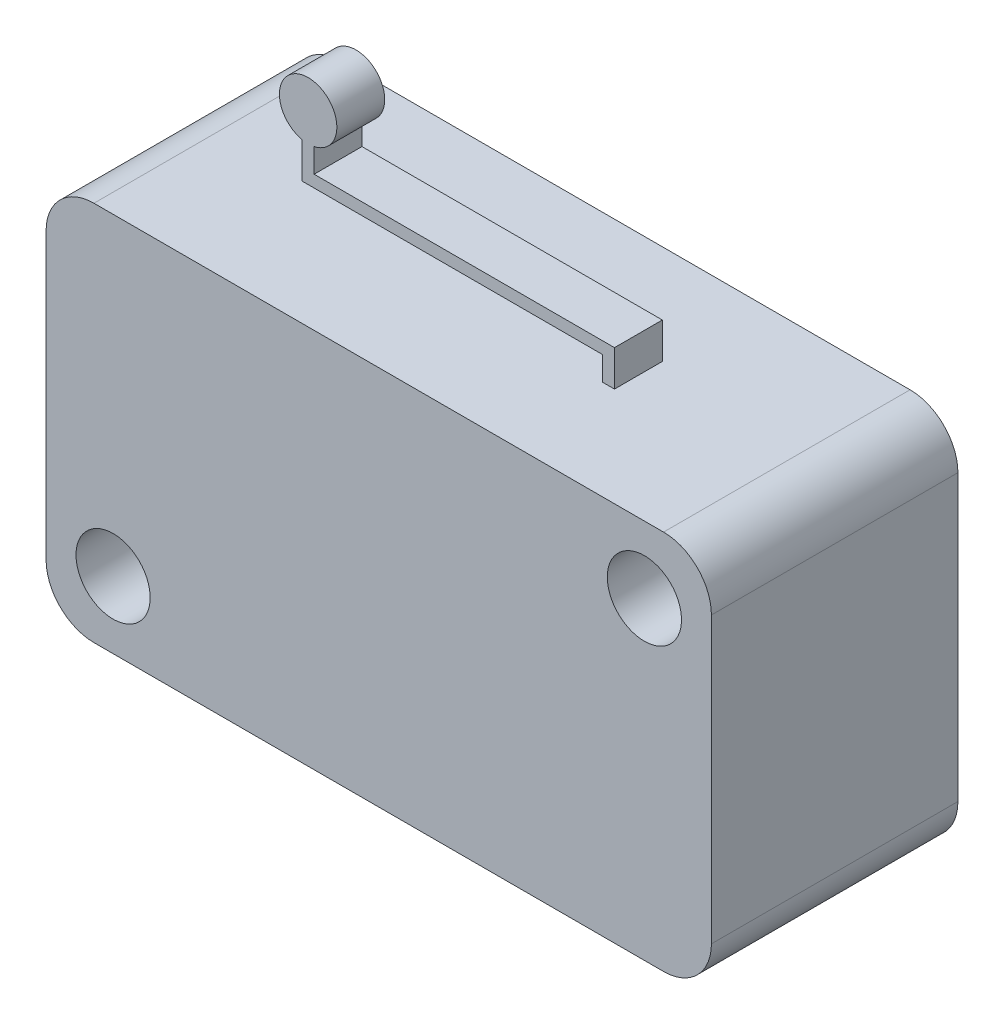
ISO-10303-21;
HEADER;
FILE_DESCRIPTION(('STEP AP214'),'2;1');
FILE_NAME('part.step','',(''),(''),'','','');
FILE_SCHEMA(('AUTOMOTIVE_DESIGN { 1 0 10303 214 1 1 1 1 }'));
ENDSEC;
DATA;
#1=APPLICATION_CONTEXT('core data for automotive mechanical design processes');
#2=APPLICATION_PROTOCOL_DEFINITION('international standard','automotive_design',2000,#1);
#3=PRODUCT_CONTEXT('',#1,'mechanical');
#4=PRODUCT('Part','Part','',(#3));
#5=PRODUCT_RELATED_PRODUCT_CATEGORY('part','',(#4));
#6=PRODUCT_DEFINITION_FORMATION('','',#4);
#7=PRODUCT_DEFINITION_CONTEXT('part definition',#1,'design');
#8=PRODUCT_DEFINITION('design','',#6,#7);
#9=PRODUCT_DEFINITION_SHAPE('','',#8);
#10=(LENGTH_UNIT() NAMED_UNIT(*) SI_UNIT(.MILLI.,.METRE.));
#11=(NAMED_UNIT(*) PLANE_ANGLE_UNIT() SI_UNIT($,.RADIAN.));
#12=(NAMED_UNIT(*) SI_UNIT($,.STERADIAN.) SOLID_ANGLE_UNIT());
#13=UNCERTAINTY_MEASURE_WITH_UNIT(LENGTH_MEASURE(1.E-05),#10,'distance_accuracy_value','');
#14=(GEOMETRIC_REPRESENTATION_CONTEXT(3) GLOBAL_UNCERTAINTY_ASSIGNED_CONTEXT((#13)) GLOBAL_UNIT_ASSIGNED_CONTEXT((#10,
#11,#12)) REPRESENTATION_CONTEXT('',''));
#15=CARTESIAN_POINT('',(0.,0.,0.));
#16=DIRECTION('',(0.,0.,1.));
#17=DIRECTION('',(1.,0.,0.));
#18=AXIS2_PLACEMENT_3D('',#15,#16,#17);
#19=CARTESIAN_POINT('',(2.00000000000001,15.9,10.3));
#20=DIRECTION('',(0.,-1.,0.));
#21=DIRECTION('',(0.,0.,-1.));
#22=AXIS2_PLACEMENT_3D('',#19,#20,#21);
#23=PLANE('',#22);
#24=DIRECTION('',(-1.,0.,0.));
#25=VECTOR('',#24,1.);
#26=CARTESIAN_POINT('',(2.00000000000001,15.9,0.));
#27=LINE('',#26,#25);
#28=CARTESIAN_POINT('',(25.8,15.9,0.));
#29=VERTEX_POINT('',#28);
#30=CARTESIAN_POINT('',(2.00000000000001,15.9,0.));
#31=VERTEX_POINT('',#30);
#32=EDGE_CURVE('E137',#29,#31,#27,.T.);
#33=ORIENTED_EDGE('',*,*,#32,.T.);
#34=DIRECTION('',(0.,0.,-1.));
#35=VECTOR('',#34,1.);
#36=CARTESIAN_POINT('',(2.00000000000001,15.9,10.3));
#37=LINE('',#36,#35);
#38=CARTESIAN_POINT('',(2.00000000000001,15.9,10.3));
#39=VERTEX_POINT('',#38);
#40=EDGE_CURVE('E134',#39,#31,#37,.T.);
#41=ORIENTED_EDGE('',*,*,#40,.F.);
#42=DIRECTION('',(-1.,0.,0.));
#43=VECTOR('',#42,1.);
#44=CARTESIAN_POINT('',(2.00000000000001,15.9,10.3));
#45=LINE('',#44,#43);
#46=CARTESIAN_POINT('',(25.8,15.9,10.3));
#47=VERTEX_POINT('',#46);
#48=EDGE_CURVE('E120',#47,#39,#45,.T.);
#49=ORIENTED_EDGE('',*,*,#48,.F.);
#50=DIRECTION('',(0.,0.,-1.));
#51=VECTOR('',#50,1.);
#52=CARTESIAN_POINT('',(25.8,15.9,10.3));
#53=LINE('',#52,#51);
#54=EDGE_CURVE('E140',#47,#29,#53,.T.);
#55=ORIENTED_EDGE('',*,*,#54,.T.);
#56=EDGE_LOOP('',(#33,#41,#49,#55));
#57=FACE_BOUND('',#56,.T.);
#58=DIRECTION('',(1.,0.,0.));
#59=VECTOR('',#58,1.);
#60=CARTESIAN_POINT('',(19.1,15.9,4.15));
#61=LINE('',#60,#59);
#62=CARTESIAN_POINT('',(19.1,15.9,4.15));
#63=VERTEX_POINT('',#62);
#64=CARTESIAN_POINT('',(19.6,15.9,4.15));
#65=VERTEX_POINT('',#64);
#66=EDGE_CURVE('E242',#63,#65,#61,.T.);
#67=ORIENTED_EDGE('',*,*,#66,.T.);
#68=DIRECTION('',(0.,0.,1.));
#69=VECTOR('',#68,1.);
#70=CARTESIAN_POINT('',(19.6,15.9,4.15));
#71=LINE('',#70,#69);
#72=CARTESIAN_POINT('',(19.6,15.9,6.15));
#73=VERTEX_POINT('',#72);
#74=EDGE_CURVE('E223',#65,#73,#71,.T.);
#75=ORIENTED_EDGE('',*,*,#74,.T.);
#76=DIRECTION('',(1.,0.,0.));
#77=VECTOR('',#76,1.);
#78=CARTESIAN_POINT('',(19.1,15.9,6.15));
#79=LINE('',#78,#77);
#80=CARTESIAN_POINT('',(19.1,15.9,6.15));
#81=VERTEX_POINT('',#80);
#82=EDGE_CURVE('E266',#81,#73,#79,.T.);
#83=ORIENTED_EDGE('',*,*,#82,.F.);
#84=DIRECTION('',(0.,0.,1.));
#85=VECTOR('',#84,1.);
#86=CARTESIAN_POINT('',(19.1,15.9,4.15));
#87=LINE('',#86,#85);
#88=EDGE_CURVE('E221',#63,#81,#87,.T.);
#89=ORIENTED_EDGE('',*,*,#88,.F.);
#90=EDGE_LOOP('',(#67,#75,#83,#89));
#91=FACE_BOUND('',#90,.T.);
#92=ADVANCED_FACE('F40',(#57,#91),#23,.F.);
#93=CARTESIAN_POINT('',(2.,2.,10.3));
#94=DIRECTION('',(0.,0.,-1.));
#95=DIRECTION('',(-1.,0.,0.));
#96=AXIS2_PLACEMENT_3D('',#93,#94,#95);
#97=PLANE('',#96);
#98=CARTESIAN_POINT('',(2.,2.,10.3));
#99=DIRECTION('',(0.,0.,1.));
#100=DIRECTION('',(-1.,0.,0.));
#101=AXIS2_PLACEMENT_3D('',#98,#99,#100);
#102=CIRCLE('',#101,2.);
#103=CARTESIAN_POINT('',(0.,2.00000000000001,10.3));
#104=VERTEX_POINT('',#103);
#105=CARTESIAN_POINT('',(2.00000000000001,0.,10.3));
#106=VERTEX_POINT('',#105);
#107=EDGE_CURVE('E165',#104,#106,#102,.T.);
#108=ORIENTED_EDGE('',*,*,#107,.T.);
#109=DIRECTION('',(1.,0.,0.));
#110=VECTOR('',#109,1.);
#111=CARTESIAN_POINT('',(2.00000000000001,0.,10.3));
#112=LINE('',#111,#110);
#113=CARTESIAN_POINT('',(25.8,0.,10.3));
#114=VERTEX_POINT('',#113);
#115=EDGE_CURVE('E105',#106,#114,#112,.T.);
#116=ORIENTED_EDGE('',*,*,#115,.T.);
#117=CARTESIAN_POINT('',(25.8,2.,10.3));
#118=DIRECTION('',(0.,0.,1.));
#119=DIRECTION('',(-1.,0.,0.));
#120=AXIS2_PLACEMENT_3D('',#117,#118,#119);
#121=CIRCLE('',#120,2.);
#122=CARTESIAN_POINT('',(27.8,2.00000000000001,10.3));
#123=VERTEX_POINT('',#122);
#124=EDGE_CURVE('E180',#114,#123,#121,.T.);
#125=ORIENTED_EDGE('',*,*,#124,.T.);
#126=DIRECTION('',(0.,1.,0.));
#127=VECTOR('',#126,1.);
#128=CARTESIAN_POINT('',(27.8,2.00000000000001,10.3));
#129=LINE('',#128,#127);
#130=CARTESIAN_POINT('',(27.8,13.9,10.3));
#131=VERTEX_POINT('',#130);
#132=EDGE_CURVE('E193',#123,#131,#129,.T.);
#133=ORIENTED_EDGE('',*,*,#132,.T.);
#134=CARTESIAN_POINT('',(25.8,13.9,10.3));
#135=DIRECTION('',(0.,0.,1.));
#136=DIRECTION('',(1.,0.,0.));
#137=AXIS2_PLACEMENT_3D('',#134,#135,#136);
#138=CIRCLE('',#137,2.);
#139=EDGE_CURVE('E128',#131,#47,#138,.T.);
#140=ORIENTED_EDGE('',*,*,#139,.T.);
#141=ORIENTED_EDGE('',*,*,#48,.T.);
#142=CARTESIAN_POINT('',(2.,13.9,10.3));
#143=DIRECTION('',(0.,0.,1.));
#144=DIRECTION('',(1.,0.,0.));
#145=AXIS2_PLACEMENT_3D('',#142,#143,#144);
#146=CIRCLE('',#145,2.);
#147=CARTESIAN_POINT('',(0.,13.9,10.3));
#148=VERTEX_POINT('',#147);
#149=EDGE_CURVE('E125',#39,#148,#146,.T.);
#150=ORIENTED_EDGE('',*,*,#149,.T.);
#151=DIRECTION('',(0.,-1.,0.));
#152=VECTOR('',#151,1.);
#153=CARTESIAN_POINT('',(0.,2.00000000000001,10.3));
#154=LINE('',#153,#152);
#155=EDGE_CURVE('E64',#148,#104,#154,.T.);
#156=ORIENTED_EDGE('',*,*,#155,.T.);
#157=EDGE_LOOP('',(#108,#116,#125,#133,#140,#141,#150,#156));
#158=FACE_BOUND('',#157,.T.);
#159=CARTESIAN_POINT('',(2.8,2.8,10.3));
#160=DIRECTION('',(0.,0.,1.));
#161=DIRECTION('',(1.,0.,0.));
#162=AXIS2_PLACEMENT_3D('',#159,#160,#161);
#163=CIRCLE('',#162,1.55);
#164=CARTESIAN_POINT('',(1.25,2.8,10.3));
#165=VERTEX_POINT('',#164);
#166=EDGE_CURVE('E153',#165,#165,#163,.T.);
#167=ORIENTED_EDGE('',*,*,#166,.F.);
#168=EDGE_LOOP('',(#167));
#169=FACE_BOUND('',#168,.T.);
#170=CARTESIAN_POINT('',(25.,13.1,10.3));
#171=DIRECTION('',(0.,0.,1.));
#172=DIRECTION('',(1.,0.,0.));
#173=AXIS2_PLACEMENT_3D('',#170,#171,#172);
#174=CIRCLE('',#173,1.55);
#175=CARTESIAN_POINT('',(23.45,13.1,10.3));
#176=VERTEX_POINT('',#175);
#177=EDGE_CURVE('E202',#176,#176,#174,.T.);
#178=ORIENTED_EDGE('',*,*,#177,.F.);
#179=EDGE_LOOP('',(#178));
#180=FACE_BOUND('',#179,.T.);
#181=ADVANCED_FACE('F122',(#158,#169,#180),#97,.F.);
#182=CARTESIAN_POINT('',(2.,2.,0.));
#183=DIRECTION('',(0.,0.,-1.));
#184=DIRECTION('',(-1.,0.,0.));
#185=AXIS2_PLACEMENT_3D('',#182,#183,#184);
#186=PLANE('',#185);
#187=CARTESIAN_POINT('',(2.8,2.8,0.));
#188=DIRECTION('',(0.,0.,1.));
#189=DIRECTION('',(1.,0.,0.));
#190=AXIS2_PLACEMENT_3D('',#187,#188,#189);
#191=CIRCLE('',#190,1.55);
#192=CARTESIAN_POINT('',(1.25,2.8,0.));
#193=VERTEX_POINT('',#192);
#194=EDGE_CURVE('E199',#193,#193,#191,.T.);
#195=ORIENTED_EDGE('',*,*,#194,.T.);
#196=EDGE_LOOP('',(#195));
#197=FACE_BOUND('',#196,.T.);
#198=CARTESIAN_POINT('',(2.,2.,0.));
#199=DIRECTION('',(0.,0.,1.));
#200=DIRECTION('',(-1.,0.,0.));
#201=AXIS2_PLACEMENT_3D('',#198,#199,#200);
#202=CIRCLE('',#201,2.);
#203=CARTESIAN_POINT('',(0.,2.00000000000001,0.));
#204=VERTEX_POINT('',#203);
#205=CARTESIAN_POINT('',(2.00000000000001,0.,0.));
#206=VERTEX_POINT('',#205);
#207=EDGE_CURVE('E149',#204,#206,#202,.T.);
#208=ORIENTED_EDGE('',*,*,#207,.F.);
#209=DIRECTION('',(0.,-1.,0.));
#210=VECTOR('',#209,1.);
#211=CARTESIAN_POINT('',(0.,2.00000000000001,0.));
#212=LINE('',#211,#210);
#213=CARTESIAN_POINT('',(0.,13.9,0.));
#214=VERTEX_POINT('',#213);
#215=EDGE_CURVE('E97',#214,#204,#212,.T.);
#216=ORIENTED_EDGE('',*,*,#215,.F.);
#217=CARTESIAN_POINT('',(2.,13.9,0.));
#218=DIRECTION('',(0.,0.,1.));
#219=DIRECTION('',(1.,0.,0.));
#220=AXIS2_PLACEMENT_3D('',#217,#218,#219);
#221=CIRCLE('',#220,2.);
#222=EDGE_CURVE('E162',#31,#214,#221,.T.);
#223=ORIENTED_EDGE('',*,*,#222,.F.);
#224=ORIENTED_EDGE('',*,*,#32,.F.);
#225=CARTESIAN_POINT('',(25.8,13.9,0.));
#226=DIRECTION('',(0.,0.,1.));
#227=DIRECTION('',(1.,0.,0.));
#228=AXIS2_PLACEMENT_3D('',#225,#226,#227);
#229=CIRCLE('',#228,2.);
#230=CARTESIAN_POINT('',(27.8,13.9,0.));
#231=VERTEX_POINT('',#230);
#232=EDGE_CURVE('E159',#231,#29,#229,.T.);
#233=ORIENTED_EDGE('',*,*,#232,.F.);
#234=DIRECTION('',(0.,1.,0.));
#235=VECTOR('',#234,1.);
#236=CARTESIAN_POINT('',(27.8,2.00000000000001,0.));
#237=LINE('',#236,#235);
#238=CARTESIAN_POINT('',(27.8,2.00000000000001,0.));
#239=VERTEX_POINT('',#238);
#240=EDGE_CURVE('E157',#239,#231,#237,.T.);
#241=ORIENTED_EDGE('',*,*,#240,.F.);
#242=CARTESIAN_POINT('',(25.8,2.,0.));
#243=DIRECTION('',(0.,0.,1.));
#244=DIRECTION('',(-1.,0.,0.));
#245=AXIS2_PLACEMENT_3D('',#242,#243,#244);
#246=CIRCLE('',#245,2.);
#247=CARTESIAN_POINT('',(25.8,0.,0.));
#248=VERTEX_POINT('',#247);
#249=EDGE_CURVE('E155',#248,#239,#246,.T.);
#250=ORIENTED_EDGE('',*,*,#249,.F.);
#251=DIRECTION('',(1.,0.,0.));
#252=VECTOR('',#251,1.);
#253=CARTESIAN_POINT('',(2.00000000000001,0.,0.));
#254=LINE('',#253,#252);
#255=EDGE_CURVE('E152',#206,#248,#254,.T.);
#256=ORIENTED_EDGE('',*,*,#255,.F.);
#257=EDGE_LOOP('',(#208,#216,#223,#224,#233,#241,#250,#256));
#258=FACE_BOUND('',#257,.T.);
#259=CARTESIAN_POINT('',(25.,13.1,0.));
#260=DIRECTION('',(0.,0.,1.));
#261=DIRECTION('',(1.,0.,0.));
#262=AXIS2_PLACEMENT_3D('',#259,#260,#261);
#263=CIRCLE('',#262,1.55);
#264=CARTESIAN_POINT('',(23.45,13.1,0.));
#265=VERTEX_POINT('',#264);
#266=EDGE_CURVE('E205',#265,#265,#263,.T.);
#267=ORIENTED_EDGE('',*,*,#266,.T.);
#268=EDGE_LOOP('',(#267));
#269=FACE_BOUND('',#268,.T.);
#270=ADVANCED_FACE('F184',(#197,#258,#269),#186,.T.);
#271=CARTESIAN_POINT('',(2.,2.,10.3));
#272=DIRECTION('',(0.,0.,-1.));
#273=DIRECTION('',(-1.,0.,0.));
#274=AXIS2_PLACEMENT_3D('',#271,#272,#273);
#275=CYLINDRICAL_SURFACE('',#274,2.);
#276=ORIENTED_EDGE('',*,*,#207,.T.);
#277=DIRECTION('',(0.,0.,-1.));
#278=VECTOR('',#277,1.);
#279=CARTESIAN_POINT('',(2.00000000000001,0.,10.3));
#280=LINE('',#279,#278);
#281=EDGE_CURVE('E11',#106,#206,#280,.T.);
#282=ORIENTED_EDGE('',*,*,#281,.F.);
#283=ORIENTED_EDGE('',*,*,#107,.F.);
#284=DIRECTION('',(0.,0.,-1.));
#285=VECTOR('',#284,1.);
#286=CARTESIAN_POINT('',(0.,2.00000000000001,10.3));
#287=LINE('',#286,#285);
#288=EDGE_CURVE('E145',#104,#204,#287,.T.);
#289=ORIENTED_EDGE('',*,*,#288,.T.);
#290=EDGE_LOOP('',(#276,#282,#283,#289));
#291=FACE_BOUND('',#290,.T.);
#292=ADVANCED_FACE('F42',(#291),#275,.T.);
#293=CARTESIAN_POINT('',(2.00000000000001,0.,10.3));
#294=DIRECTION('',(0.,1.,0.));
#295=DIRECTION('',(0.,0.,1.));
#296=AXIS2_PLACEMENT_3D('',#293,#294,#295);
#297=PLANE('',#296);
#298=ORIENTED_EDGE('',*,*,#255,.T.);
#299=DIRECTION('',(0.,0.,-1.));
#300=VECTOR('',#299,1.);
#301=CARTESIAN_POINT('',(25.8,0.,10.3));
#302=LINE('',#301,#300);
#303=EDGE_CURVE('E48',#114,#248,#302,.T.);
#304=ORIENTED_EDGE('',*,*,#303,.F.);
#305=ORIENTED_EDGE('',*,*,#115,.F.);
#306=ORIENTED_EDGE('',*,*,#281,.T.);
#307=EDGE_LOOP('',(#298,#304,#305,#306));
#308=FACE_BOUND('',#307,.T.);
#309=ADVANCED_FACE('F367',(#308),#297,.F.);
#310=CARTESIAN_POINT('',(25.8,2.,10.3));
#311=DIRECTION('',(0.,0.,-1.));
#312=DIRECTION('',(-1.,0.,0.));
#313=AXIS2_PLACEMENT_3D('',#310,#311,#312);
#314=CYLINDRICAL_SURFACE('',#313,2.);
#315=ORIENTED_EDGE('',*,*,#249,.T.);
#316=DIRECTION('',(0.,0.,-1.));
#317=VECTOR('',#316,1.);
#318=CARTESIAN_POINT('',(27.8,2.00000000000001,10.3));
#319=LINE('',#318,#317);
#320=EDGE_CURVE('E172',#123,#239,#319,.T.);
#321=ORIENTED_EDGE('',*,*,#320,.F.);
#322=ORIENTED_EDGE('',*,*,#124,.F.);
#323=ORIENTED_EDGE('',*,*,#303,.T.);
#324=EDGE_LOOP('',(#315,#321,#322,#323));
#325=FACE_BOUND('',#324,.T.);
#326=ADVANCED_FACE('F178',(#325),#314,.T.);
#327=CARTESIAN_POINT('',(27.8,2.00000000000001,10.3));
#328=DIRECTION('',(-1.,0.,0.));
#329=DIRECTION('',(0.,0.,1.));
#330=AXIS2_PLACEMENT_3D('',#327,#328,#329);
#331=PLANE('',#330);
#332=ORIENTED_EDGE('',*,*,#240,.T.);
#333=DIRECTION('',(0.,0.,-1.));
#334=VECTOR('',#333,1.);
#335=CARTESIAN_POINT('',(27.8,13.9,10.3));
#336=LINE('',#335,#334);
#337=EDGE_CURVE('E169',#131,#231,#336,.T.);
#338=ORIENTED_EDGE('',*,*,#337,.F.);
#339=ORIENTED_EDGE('',*,*,#132,.F.);
#340=ORIENTED_EDGE('',*,*,#320,.T.);
#341=EDGE_LOOP('',(#332,#338,#339,#340));
#342=FACE_BOUND('',#341,.T.);
#343=ADVANCED_FACE('F189',(#342),#331,.F.);
#344=CARTESIAN_POINT('',(25.8,13.9,10.3));
#345=DIRECTION('',(0.,0.,-1.));
#346=DIRECTION('',(-1.,0.,0.));
#347=AXIS2_PLACEMENT_3D('',#344,#345,#346);
#348=CYLINDRICAL_SURFACE('',#347,2.);
#349=ORIENTED_EDGE('',*,*,#232,.T.);
#350=ORIENTED_EDGE('',*,*,#54,.F.);
#351=ORIENTED_EDGE('',*,*,#139,.F.);
#352=ORIENTED_EDGE('',*,*,#337,.T.);
#353=EDGE_LOOP('',(#349,#350,#351,#352));
#354=FACE_BOUND('',#353,.T.);
#355=ADVANCED_FACE('F192',(#354),#348,.T.);
#356=CARTESIAN_POINT('',(2.,13.9,10.3));
#357=DIRECTION('',(0.,0.,-1.));
#358=DIRECTION('',(-1.,0.,0.));
#359=AXIS2_PLACEMENT_3D('',#356,#357,#358);
#360=CYLINDRICAL_SURFACE('',#359,2.);
#361=ORIENTED_EDGE('',*,*,#222,.T.);
#362=DIRECTION('',(0.,0.,-1.));
#363=VECTOR('',#362,1.);
#364=CARTESIAN_POINT('',(0.,13.9,10.3));
#365=LINE('',#364,#363);
#366=EDGE_CURVE('E141',#148,#214,#365,.T.);
#367=ORIENTED_EDGE('',*,*,#366,.F.);
#368=ORIENTED_EDGE('',*,*,#149,.F.);
#369=ORIENTED_EDGE('',*,*,#40,.T.);
#370=EDGE_LOOP('',(#361,#367,#368,#369));
#371=FACE_BOUND('',#370,.T.);
#372=ADVANCED_FACE('F143',(#371),#360,.T.);
#373=CARTESIAN_POINT('',(0.,2.00000000000001,10.3));
#374=DIRECTION('',(1.,0.,0.));
#375=DIRECTION('',(0.,0.,-1.));
#376=AXIS2_PLACEMENT_3D('',#373,#374,#375);
#377=PLANE('',#376);
#378=ORIENTED_EDGE('',*,*,#215,.T.);
#379=ORIENTED_EDGE('',*,*,#288,.F.);
#380=ORIENTED_EDGE('',*,*,#155,.F.);
#381=ORIENTED_EDGE('',*,*,#366,.T.);
#382=EDGE_LOOP('',(#378,#379,#380,#381));
#383=FACE_BOUND('',#382,.T.);
#384=ADVANCED_FACE('F375',(#383),#377,.F.);
#385=CARTESIAN_POINT('',(2.8,2.8,10.3));
#386=DIRECTION('',(0.,0.,-1.));
#387=DIRECTION('',(-1.,0.,0.));
#388=AXIS2_PLACEMENT_3D('',#385,#386,#387);
#389=CYLINDRICAL_SURFACE('',#388,1.55);
#390=CARTESIAN_POINT('',(1.25,2.8,10.3));
#391=CARTESIAN_POINT('',(1.25,2.8,10.1927083333333));
#392=CARTESIAN_POINT('',(1.25,2.8,10.0854166666667));
#393=CARTESIAN_POINT('',(1.25,2.8,9.87083333333333));
#394=CARTESIAN_POINT('',(1.25,2.8,9.76354166666667));
#395=CARTESIAN_POINT('',(1.25,2.8,9.54895833333333));
#396=CARTESIAN_POINT('',(1.25,2.8,9.44166666666667));
#397=CARTESIAN_POINT('',(1.25,2.8,9.22708333333333));
#398=CARTESIAN_POINT('',(1.25,2.8,9.11979166666667));
#399=CARTESIAN_POINT('',(1.25,2.8,8.90520833333333));
#400=CARTESIAN_POINT('',(1.25,2.8,8.79791666666667));
#401=CARTESIAN_POINT('',(1.25,2.8,8.58333333333333));
#402=CARTESIAN_POINT('',(1.25,2.8,8.47604166666667));
#403=CARTESIAN_POINT('',(1.25,2.8,8.26145833333333));
#404=CARTESIAN_POINT('',(1.25,2.8,8.15416666666667));
#405=CARTESIAN_POINT('',(1.25,2.8,7.93958333333333));
#406=CARTESIAN_POINT('',(1.25,2.8,7.83229166666667));
#407=CARTESIAN_POINT('',(1.25,2.8,7.61770833333333));
#408=CARTESIAN_POINT('',(1.25,2.8,7.51041666666667));
#409=CARTESIAN_POINT('',(1.25,2.8,7.29583333333333));
#410=CARTESIAN_POINT('',(1.25,2.8,7.18854166666666));
#411=CARTESIAN_POINT('',(1.25,2.8,6.97395833333333));
#412=CARTESIAN_POINT('',(1.25,2.8,6.86666666666667));
#413=CARTESIAN_POINT('',(1.25,2.8,6.65208333333333));
#414=CARTESIAN_POINT('',(1.25,2.8,6.54479166666667));
#415=CARTESIAN_POINT('',(1.25,2.8,6.33020833333333));
#416=CARTESIAN_POINT('',(1.25,2.8,6.22291666666667));
#417=CARTESIAN_POINT('',(1.25,2.8,6.00833333333333));
#418=CARTESIAN_POINT('',(1.25,2.8,5.90104166666667));
#419=CARTESIAN_POINT('',(1.25,2.8,5.68645833333333));
#420=CARTESIAN_POINT('',(1.25,2.8,5.57916666666667));
#421=CARTESIAN_POINT('',(1.25,2.8,5.36458333333333));
#422=CARTESIAN_POINT('',(1.25,2.8,5.25729166666667));
#423=CARTESIAN_POINT('',(1.25,2.8,5.04270833333333));
#424=CARTESIAN_POINT('',(1.25,2.8,4.93541666666667));
#425=CARTESIAN_POINT('',(1.25,2.8,4.72083333333333));
#426=CARTESIAN_POINT('',(1.25,2.8,4.61354166666666));
#427=CARTESIAN_POINT('',(1.25,2.8,4.39895833333333));
#428=CARTESIAN_POINT('',(1.25,2.8,4.29166666666667));
#429=CARTESIAN_POINT('',(1.25,2.8,4.07708333333333));
#430=CARTESIAN_POINT('',(1.25,2.8,3.96979166666666));
#431=CARTESIAN_POINT('',(1.25,2.8,3.75520833333333));
#432=CARTESIAN_POINT('',(1.25,2.8,3.64791666666666));
#433=CARTESIAN_POINT('',(1.25,2.8,3.43333333333333));
#434=CARTESIAN_POINT('',(1.25,2.8,3.32604166666666));
#435=CARTESIAN_POINT('',(1.25,2.8,3.11145833333333));
#436=CARTESIAN_POINT('',(1.25,2.8,3.00416666666666));
#437=CARTESIAN_POINT('',(1.25,2.8,2.78958333333333));
#438=CARTESIAN_POINT('',(1.25,2.8,2.68229166666666));
#439=CARTESIAN_POINT('',(1.25,2.8,2.46770833333333));
#440=CARTESIAN_POINT('',(1.25,2.8,2.36041666666667));
#441=CARTESIAN_POINT('',(1.25,2.8,2.14583333333333));
#442=CARTESIAN_POINT('',(1.25,2.8,2.03854166666667));
#443=CARTESIAN_POINT('',(1.25,2.8,1.82395833333333));
#444=CARTESIAN_POINT('',(1.25,2.8,1.71666666666667));
#445=CARTESIAN_POINT('',(1.25,2.8,1.50208333333333));
#446=CARTESIAN_POINT('',(1.25,2.8,1.39479166666667));
#447=CARTESIAN_POINT('',(1.25,2.8,1.18020833333333));
#448=CARTESIAN_POINT('',(1.25,2.8,1.07291666666667));
#449=CARTESIAN_POINT('',(1.25,2.8,0.858333333333333));
#450=CARTESIAN_POINT('',(1.25,2.8,0.751041666666665));
#451=CARTESIAN_POINT('',(1.25,2.8,0.536458333333331));
#452=CARTESIAN_POINT('',(1.25,2.8,0.429166666666664));
#453=CARTESIAN_POINT('',(1.25,2.8,0.214583333333331));
#454=CARTESIAN_POINT('',(1.25,2.8,0.107291666666665));
#455=CARTESIAN_POINT('',(1.25,2.8,0.));
#456=B_SPLINE_CURVE_WITH_KNOTS('',3,(#390,#391,#392,#393,#394,#395,#396,#397,#398,#399,#400,
#401,#402,#403,#404,#405,#406,#407,#408,#409,#410,#411,#412,#413,#414,#415,#416,#417,#418,#419,
#420,#421,#422,#423,#424,#425,#426,#427,#428,#429,#430,#431,#432,#433,#434,#435,#436,#437,#438,
#439,#440,#441,#442,#443,#444,#445,#446,#447,#448,#449,#450,#451,#452,#453,#454,#455),
.UNSPECIFIED.,.F.,.F.,(4,2,2,2,2,2,2,2,2,2,2,2,2,2,2,2,2,2,2,2,2,2,2,2,2,2,2,2,2,2,2,2,4),(0.,
0.321875000000001,0.64375,0.965625000000001,1.2875,1.609375,1.93125,2.253125,2.575,2.896875,
3.21875,3.540625,3.8625,4.184375,4.50625,4.828125,5.15,5.471875,5.79375,6.115625,6.4375,
6.759375,7.08125,7.403125,7.725,8.046875,8.36875,8.690625,9.0125,9.334375,9.65625,9.978125,
10.3),.UNSPECIFIED.);
#457=EDGE_CURVE('BSEAM377',#165,#193,#456,.T.);
#458=ORIENTED_EDGE('',*,*,#166,.T.);
#459=ORIENTED_EDGE('',*,*,#194,.F.);
#460=ORIENTED_EDGE('',*,*,#457,.T.);
#461=ORIENTED_EDGE('',*,*,#457,.F.);
#462=EDGE_LOOP('',(#458,#460,#459,#461));
#463=FACE_BOUND('',#462,.T.);
#464=ADVANCED_FACE('F377',(#463),#389,.F.);
#465=CARTESIAN_POINT('',(25.,13.1,10.3));
#466=DIRECTION('',(0.,0.,-1.));
#467=DIRECTION('',(-1.,0.,0.));
#468=AXIS2_PLACEMENT_3D('',#465,#466,#467);
#469=CYLINDRICAL_SURFACE('',#468,1.55);
#470=CARTESIAN_POINT('',(23.45,13.1,10.3));
#471=CARTESIAN_POINT('',(23.45,13.1,10.1927083333333));
#472=CARTESIAN_POINT('',(23.45,13.1,10.0854166666667));
#473=CARTESIAN_POINT('',(23.45,13.1,9.87083333333333));
#474=CARTESIAN_POINT('',(23.45,13.1,9.76354166666667));
#475=CARTESIAN_POINT('',(23.45,13.1,9.54895833333333));
#476=CARTESIAN_POINT('',(23.45,13.1,9.44166666666667));
#477=CARTESIAN_POINT('',(23.45,13.1,9.22708333333333));
#478=CARTESIAN_POINT('',(23.45,13.1,9.11979166666667));
#479=CARTESIAN_POINT('',(23.45,13.1,8.90520833333333));
#480=CARTESIAN_POINT('',(23.45,13.1,8.79791666666667));
#481=CARTESIAN_POINT('',(23.45,13.1,8.58333333333333));
#482=CARTESIAN_POINT('',(23.45,13.1,8.47604166666667));
#483=CARTESIAN_POINT('',(23.45,13.1,8.26145833333333));
#484=CARTESIAN_POINT('',(23.45,13.1,8.15416666666667));
#485=CARTESIAN_POINT('',(23.45,13.1,7.93958333333333));
#486=CARTESIAN_POINT('',(23.45,13.1,7.83229166666667));
#487=CARTESIAN_POINT('',(23.45,13.1,7.61770833333333));
#488=CARTESIAN_POINT('',(23.45,13.1,7.51041666666667));
#489=CARTESIAN_POINT('',(23.45,13.1,7.29583333333333));
#490=CARTESIAN_POINT('',(23.45,13.1,7.18854166666666));
#491=CARTESIAN_POINT('',(23.45,13.1,6.97395833333333));
#492=CARTESIAN_POINT('',(23.45,13.1,6.86666666666667));
#493=CARTESIAN_POINT('',(23.45,13.1,6.65208333333333));
#494=CARTESIAN_POINT('',(23.45,13.1,6.54479166666667));
#495=CARTESIAN_POINT('',(23.45,13.1,6.33020833333333));
#496=CARTESIAN_POINT('',(23.45,13.1,6.22291666666667));
#497=CARTESIAN_POINT('',(23.45,13.1,6.00833333333333));
#498=CARTESIAN_POINT('',(23.45,13.1,5.90104166666667));
#499=CARTESIAN_POINT('',(23.45,13.1,5.68645833333333));
#500=CARTESIAN_POINT('',(23.45,13.1,5.57916666666667));
#501=CARTESIAN_POINT('',(23.45,13.1,5.36458333333333));
#502=CARTESIAN_POINT('',(23.45,13.1,5.25729166666667));
#503=CARTESIAN_POINT('',(23.45,13.1,5.04270833333333));
#504=CARTESIAN_POINT('',(23.45,13.1,4.93541666666667));
#505=CARTESIAN_POINT('',(23.45,13.1,4.72083333333333));
#506=CARTESIAN_POINT('',(23.45,13.1,4.61354166666666));
#507=CARTESIAN_POINT('',(23.45,13.1,4.39895833333333));
#508=CARTESIAN_POINT('',(23.45,13.1,4.29166666666667));
#509=CARTESIAN_POINT('',(23.45,13.1,4.07708333333333));
#510=CARTESIAN_POINT('',(23.45,13.1,3.96979166666666));
#511=CARTESIAN_POINT('',(23.45,13.1,3.75520833333333));
#512=CARTESIAN_POINT('',(23.45,13.1,3.64791666666666));
#513=CARTESIAN_POINT('',(23.45,13.1,3.43333333333333));
#514=CARTESIAN_POINT('',(23.45,13.1,3.32604166666666));
#515=CARTESIAN_POINT('',(23.45,13.1,3.11145833333333));
#516=CARTESIAN_POINT('',(23.45,13.1,3.00416666666666));
#517=CARTESIAN_POINT('',(23.45,13.1,2.78958333333333));
#518=CARTESIAN_POINT('',(23.45,13.1,2.68229166666666));
#519=CARTESIAN_POINT('',(23.45,13.1,2.46770833333333));
#520=CARTESIAN_POINT('',(23.45,13.1,2.36041666666667));
#521=CARTESIAN_POINT('',(23.45,13.1,2.14583333333333));
#522=CARTESIAN_POINT('',(23.45,13.1,2.03854166666667));
#523=CARTESIAN_POINT('',(23.45,13.1,1.82395833333333));
#524=CARTESIAN_POINT('',(23.45,13.1,1.71666666666667));
#525=CARTESIAN_POINT('',(23.45,13.1,1.50208333333333));
#526=CARTESIAN_POINT('',(23.45,13.1,1.39479166666667));
#527=CARTESIAN_POINT('',(23.45,13.1,1.18020833333333));
#528=CARTESIAN_POINT('',(23.45,13.1,1.07291666666667));
#529=CARTESIAN_POINT('',(23.45,13.1,0.858333333333333));
#530=CARTESIAN_POINT('',(23.45,13.1,0.751041666666665));
#531=CARTESIAN_POINT('',(23.45,13.1,0.536458333333331));
#532=CARTESIAN_POINT('',(23.45,13.1,0.429166666666664));
#533=CARTESIAN_POINT('',(23.45,13.1,0.214583333333331));
#534=CARTESIAN_POINT('',(23.45,13.1,0.107291666666665));
#535=CARTESIAN_POINT('',(23.45,13.1,0.));
#536=B_SPLINE_CURVE_WITH_KNOTS('',3,(#470,#471,#472,#473,#474,#475,#476,#477,#478,#479,#480,
#481,#482,#483,#484,#485,#486,#487,#488,#489,#490,#491,#492,#493,#494,#495,#496,#497,#498,#499,
#500,#501,#502,#503,#504,#505,#506,#507,#508,#509,#510,#511,#512,#513,#514,#515,#516,#517,#518,
#519,#520,#521,#522,#523,#524,#525,#526,#527,#528,#529,#530,#531,#532,#533,#534,#535),
.UNSPECIFIED.,.F.,.F.,(4,2,2,2,2,2,2,2,2,2,2,2,2,2,2,2,2,2,2,2,2,2,2,2,2,2,2,2,2,2,2,2,4),(0.,
0.321875000000001,0.64375,0.965625000000001,1.2875,1.609375,1.93125,2.253125,2.575,2.896875,
3.21875,3.540625,3.8625,4.184375,4.50625,4.828125,5.15,5.471875,5.79375,6.115625,6.4375,
6.759375,7.08125,7.403125,7.725,8.046875,8.36875,8.690625,9.0125,9.334375,9.65625,9.978125,
10.3),.UNSPECIFIED.);
#537=EDGE_CURVE('BSEAM382',#176,#265,#536,.T.);
#538=ORIENTED_EDGE('',*,*,#177,.T.);
#539=ORIENTED_EDGE('',*,*,#266,.F.);
#540=ORIENTED_EDGE('',*,*,#537,.T.);
#541=ORIENTED_EDGE('',*,*,#537,.F.);
#542=EDGE_LOOP('',(#538,#540,#539,#541));
#543=FACE_BOUND('',#542,.T.);
#544=ADVANCED_FACE('F382',(#543),#469,.F.);
#545=CARTESIAN_POINT('',(6.8,19.5736694594306,4.15));
#546=DIRECTION('',(0.,0.,1.));
#547=DIRECTION('',(1.,0.,0.));
#548=AXIS2_PLACEMENT_3D('',#545,#546,#547);
#549=CYLINDRICAL_SURFACE('',#548,1.2);
#550=DIRECTION('',(0.,0.,1.));
#551=VECTOR('',#550,1.);
#552=CARTESIAN_POINT('',(6.55,18.4,4.15));
#553=LINE('',#552,#551);
#554=CARTESIAN_POINT('',(6.55,18.4,4.15));
#555=VERTEX_POINT('',#554);
#556=CARTESIAN_POINT('',(6.55,18.4,6.15));
#557=VERTEX_POINT('',#556);
#558=EDGE_CURVE('E211',#555,#557,#553,.T.);
#559=ORIENTED_EDGE('',*,*,#558,.T.);
#560=CARTESIAN_POINT('',(6.8,19.5736694594306,6.15));
#561=DIRECTION('',(0.,0.,1.));
#562=DIRECTION('',(1.,0.,0.));
#563=AXIS2_PLACEMENT_3D('',#560,#561,#562);
#564=CIRCLE('',#563,1.2);
#565=CARTESIAN_POINT('',(7.05,18.4,6.15));
#566=VERTEX_POINT('',#565);
#567=EDGE_CURVE('E274',#566,#557,#564,.T.);
#568=ORIENTED_EDGE('',*,*,#567,.F.);
#569=DIRECTION('',(0.,0.,1.));
#570=VECTOR('',#569,1.);
#571=CARTESIAN_POINT('',(7.05,18.4,4.15));
#572=LINE('',#571,#570);
#573=CARTESIAN_POINT('',(7.05,18.4,4.15));
#574=VERTEX_POINT('',#573);
#575=EDGE_CURVE('E208',#574,#566,#572,.T.);
#576=ORIENTED_EDGE('',*,*,#575,.F.);
#577=CARTESIAN_POINT('',(6.8,19.5736694594306,4.15));
#578=DIRECTION('',(0.,0.,1.));
#579=DIRECTION('',(1.,0.,0.));
#580=AXIS2_PLACEMENT_3D('',#577,#578,#579);
#581=CIRCLE('',#580,1.2);
#582=EDGE_CURVE('E254',#574,#555,#581,.T.);
#583=ORIENTED_EDGE('',*,*,#582,.T.);
#584=EDGE_LOOP('',(#559,#568,#576,#583));
#585=FACE_BOUND('',#584,.T.);
#586=ADVANCED_FACE('F287',(#585),#549,.T.);
#587=CARTESIAN_POINT('',(7.05,18.4,4.15));
#588=DIRECTION('',(1.,0.,0.));
#589=DIRECTION('',(0.,1.,0.));
#590=AXIS2_PLACEMENT_3D('',#587,#588,#589);
#591=PLANE('',#590);
#592=ORIENTED_EDGE('',*,*,#575,.T.);
#593=DIRECTION('',(0.,1.,0.));
#594=VECTOR('',#593,1.);
#595=CARTESIAN_POINT('',(7.05,18.4,6.15));
#596=LINE('',#595,#594);
#597=CARTESIAN_POINT('',(7.05,17.4,6.15));
#598=VERTEX_POINT('',#597);
#599=EDGE_CURVE('E257',#598,#566,#596,.T.);
#600=ORIENTED_EDGE('',*,*,#599,.F.);
#601=DIRECTION('',(0.,0.,1.));
#602=VECTOR('',#601,1.);
#603=CARTESIAN_POINT('',(7.05,17.4,4.15));
#604=LINE('',#603,#602);
#605=CARTESIAN_POINT('',(7.05,17.4,4.15));
#606=VERTEX_POINT('',#605);
#607=EDGE_CURVE('E229',#606,#598,#604,.T.);
#608=ORIENTED_EDGE('',*,*,#607,.F.);
#609=DIRECTION('',(0.,1.,0.));
#610=VECTOR('',#609,1.);
#611=CARTESIAN_POINT('',(7.05,18.4,4.15));
#612=LINE('',#611,#610);
#613=EDGE_CURVE('E215',#606,#574,#612,.T.);
#614=ORIENTED_EDGE('',*,*,#613,.T.);
#615=EDGE_LOOP('',(#592,#600,#608,#614));
#616=FACE_BOUND('',#615,.T.);
#617=ADVANCED_FACE('F314',(#616),#591,.T.);
#618=CARTESIAN_POINT('',(19.6,17.4,4.15));
#619=DIRECTION('',(0.,1.,0.));
#620=DIRECTION('',(0.,0.,1.));
#621=AXIS2_PLACEMENT_3D('',#618,#619,#620);
#622=PLANE('',#621);
#623=ORIENTED_EDGE('',*,*,#607,.T.);
#624=DIRECTION('',(-1.,0.,0.));
#625=VECTOR('',#624,1.);
#626=CARTESIAN_POINT('',(19.6,17.4,6.15));
#627=LINE('',#626,#625);
#628=CARTESIAN_POINT('',(19.6,17.4,6.15));
#629=VERTEX_POINT('',#628);
#630=EDGE_CURVE('E260',#629,#598,#627,.T.);
#631=ORIENTED_EDGE('',*,*,#630,.F.);
#632=DIRECTION('',(0.,0.,1.));
#633=VECTOR('',#632,1.);
#634=CARTESIAN_POINT('',(19.6,17.4,4.15));
#635=LINE('',#634,#633);
#636=CARTESIAN_POINT('',(19.6,17.4,4.15));
#637=VERTEX_POINT('',#636);
#638=EDGE_CURVE('E226',#637,#629,#635,.T.);
#639=ORIENTED_EDGE('',*,*,#638,.F.);
#640=DIRECTION('',(-1.,0.,0.));
#641=VECTOR('',#640,1.);
#642=CARTESIAN_POINT('',(19.6,17.4,4.15));
#643=LINE('',#642,#641);
#644=EDGE_CURVE('E236',#637,#606,#643,.T.);
#645=ORIENTED_EDGE('',*,*,#644,.T.);
#646=EDGE_LOOP('',(#623,#631,#639,#645));
#647=FACE_BOUND('',#646,.T.);
#648=ADVANCED_FACE('F319',(#647),#622,.T.);
#649=CARTESIAN_POINT('',(19.6,15.9,4.15));
#650=DIRECTION('',(1.,0.,0.));
#651=DIRECTION('',(0.,0.,-1.));
#652=AXIS2_PLACEMENT_3D('',#649,#650,#651);
#653=PLANE('',#652);
#654=ORIENTED_EDGE('',*,*,#638,.T.);
#655=DIRECTION('',(0.,1.,0.));
#656=VECTOR('',#655,1.);
#657=CARTESIAN_POINT('',(19.6,15.9,6.15));
#658=LINE('',#657,#656);
#659=EDGE_CURVE('E263',#73,#629,#658,.T.);
#660=ORIENTED_EDGE('',*,*,#659,.F.);
#661=ORIENTED_EDGE('',*,*,#74,.F.);
#662=DIRECTION('',(0.,1.,0.));
#663=VECTOR('',#662,1.);
#664=CARTESIAN_POINT('',(19.6,15.9,4.15));
#665=LINE('',#664,#663);
#666=EDGE_CURVE('E239',#65,#637,#665,.T.);
#667=ORIENTED_EDGE('',*,*,#666,.T.);
#668=EDGE_LOOP('',(#654,#660,#661,#667));
#669=FACE_BOUND('',#668,.T.);
#670=ADVANCED_FACE('F342',(#669),#653,.T.);
#671=CARTESIAN_POINT('',(19.1,16.9,4.15));
#672=DIRECTION('',(-1.,0.,0.));
#673=DIRECTION('',(0.,0.,1.));
#674=AXIS2_PLACEMENT_3D('',#671,#672,#673);
#675=PLANE('',#674);
#676=ORIENTED_EDGE('',*,*,#88,.T.);
#677=DIRECTION('',(0.,-1.,0.));
#678=VECTOR('',#677,1.);
#679=CARTESIAN_POINT('',(19.1,16.9,6.15));
#680=LINE('',#679,#678);
#681=CARTESIAN_POINT('',(19.1,16.9,6.15));
#682=VERTEX_POINT('',#681);
#683=EDGE_CURVE('E55',#682,#81,#680,.T.);
#684=ORIENTED_EDGE('',*,*,#683,.F.);
#685=DIRECTION('',(0.,0.,1.));
#686=VECTOR('',#685,1.);
#687=CARTESIAN_POINT('',(19.1,16.9,4.15));
#688=LINE('',#687,#686);
#689=CARTESIAN_POINT('',(19.1,16.9,4.15));
#690=VERTEX_POINT('',#689);
#691=EDGE_CURVE('E218',#690,#682,#688,.T.);
#692=ORIENTED_EDGE('',*,*,#691,.F.);
#693=DIRECTION('',(0.,-1.,0.));
#694=VECTOR('',#693,1.);
#695=CARTESIAN_POINT('',(19.1,16.9,4.15));
#696=LINE('',#695,#694);
#697=EDGE_CURVE('E245',#690,#63,#696,.T.);
#698=ORIENTED_EDGE('',*,*,#697,.T.);
#699=EDGE_LOOP('',(#676,#684,#692,#698));
#700=FACE_BOUND('',#699,.T.);
#701=ADVANCED_FACE('F336',(#700),#675,.T.);
#702=CARTESIAN_POINT('',(7.05,16.9,4.15));
#703=DIRECTION('',(0.,-1.,0.));
#704=DIRECTION('',(0.,0.,-1.));
#705=AXIS2_PLACEMENT_3D('',#702,#703,#704);
#706=PLANE('',#705);
#707=ORIENTED_EDGE('',*,*,#691,.T.);
#708=DIRECTION('',(1.,0.,0.));
#709=VECTOR('',#708,1.);
#710=CARTESIAN_POINT('',(6.55,16.9,6.15));
#711=LINE('',#710,#709);
#712=CARTESIAN_POINT('',(6.55,16.9,6.15));
#713=VERTEX_POINT('',#712);
#714=EDGE_CURVE('E269',#713,#682,#711,.T.);
#715=ORIENTED_EDGE('',*,*,#714,.F.);
#716=DIRECTION('',(0.,0.,1.));
#717=VECTOR('',#716,1.);
#718=CARTESIAN_POINT('',(6.55,16.9,4.15));
#719=LINE('',#718,#717);
#720=CARTESIAN_POINT('',(6.55,16.9,4.15));
#721=VERTEX_POINT('',#720);
#722=EDGE_CURVE('E214',#721,#713,#719,.T.);
#723=ORIENTED_EDGE('',*,*,#722,.F.);
#724=DIRECTION('',(1.,0.,0.));
#725=VECTOR('',#724,1.);
#726=CARTESIAN_POINT('',(6.55,16.9,4.15));
#727=LINE('',#726,#725);
#728=EDGE_CURVE('E248',#721,#690,#727,.T.);
#729=ORIENTED_EDGE('',*,*,#728,.T.);
#730=EDGE_LOOP('',(#707,#715,#723,#729));
#731=FACE_BOUND('',#730,.T.);
#732=ADVANCED_FACE('F331',(#731),#706,.T.);
#733=CARTESIAN_POINT('',(6.55,18.4,4.15));
#734=DIRECTION('',(-1.,0.,0.));
#735=DIRECTION('',(0.,-1.,0.));
#736=AXIS2_PLACEMENT_3D('',#733,#734,#735);
#737=PLANE('',#736);
#738=ORIENTED_EDGE('',*,*,#722,.T.);
#739=DIRECTION('',(0.,-1.,0.));
#740=VECTOR('',#739,1.);
#741=CARTESIAN_POINT('',(6.55,18.4,6.15));
#742=LINE('',#741,#740);
#743=EDGE_CURVE('E271',#557,#713,#742,.T.);
#744=ORIENTED_EDGE('',*,*,#743,.F.);
#745=ORIENTED_EDGE('',*,*,#558,.F.);
#746=DIRECTION('',(0.,-1.,0.));
#747=VECTOR('',#746,1.);
#748=CARTESIAN_POINT('',(6.55,18.4,4.15));
#749=LINE('',#748,#747);
#750=EDGE_CURVE('E251',#555,#721,#749,.T.);
#751=ORIENTED_EDGE('',*,*,#750,.T.);
#752=EDGE_LOOP('',(#738,#744,#745,#751));
#753=FACE_BOUND('',#752,.T.);
#754=ADVANCED_FACE('F327',(#753),#737,.T.);
#755=CARTESIAN_POINT('',(6.8,19.5736694594306,4.15));
#756=DIRECTION('',(0.,0.,1.));
#757=DIRECTION('',(1.,0.,0.));
#758=AXIS2_PLACEMENT_3D('',#755,#756,#757);
#759=PLANE('',#758);
#760=ORIENTED_EDGE('',*,*,#582,.F.);
#761=ORIENTED_EDGE('',*,*,#613,.F.);
#762=ORIENTED_EDGE('',*,*,#644,.F.);
#763=ORIENTED_EDGE('',*,*,#666,.F.);
#764=ORIENTED_EDGE('',*,*,#66,.F.);
#765=ORIENTED_EDGE('',*,*,#697,.F.);
#766=ORIENTED_EDGE('',*,*,#728,.F.);
#767=ORIENTED_EDGE('',*,*,#750,.F.);
#768=EDGE_LOOP('',(#760,#761,#762,#763,#764,#765,#766,#767));
#769=FACE_BOUND('',#768,.T.);
#770=ADVANCED_FACE('F322',(#769),#759,.F.);
#771=CARTESIAN_POINT('',(6.8,19.5736694594306,6.15));
#772=DIRECTION('',(0.,0.,1.));
#773=DIRECTION('',(1.,0.,0.));
#774=AXIS2_PLACEMENT_3D('',#771,#772,#773);
#775=PLANE('',#774);
#776=ORIENTED_EDGE('',*,*,#567,.T.);
#777=ORIENTED_EDGE('',*,*,#743,.T.);
#778=ORIENTED_EDGE('',*,*,#714,.T.);
#779=ORIENTED_EDGE('',*,*,#683,.T.);
#780=ORIENTED_EDGE('',*,*,#82,.T.);
#781=ORIENTED_EDGE('',*,*,#659,.T.);
#782=ORIENTED_EDGE('',*,*,#630,.T.);
#783=ORIENTED_EDGE('',*,*,#599,.T.);
#784=EDGE_LOOP('',(#776,#777,#778,#779,#780,#781,#782,#783));
#785=FACE_BOUND('',#784,.T.);
#786=ADVANCED_FACE('F278',(#785),#775,.T.);
#787=CLOSED_SHELL('',(#92,#181,#270,#292,#309,#326,#343,#355,#372,#384,#464,#544,#586,#617,#648,
#670,#701,#732,#754,#770,#786));
#788=MANIFOLD_SOLID_BREP('B2',#787);
#789=ADVANCED_BREP_SHAPE_REPRESENTATION('',(#18,#788),#14);
#790=SHAPE_DEFINITION_REPRESENTATION(#9,#789);
ENDSEC;
END-ISO-10303-21;
